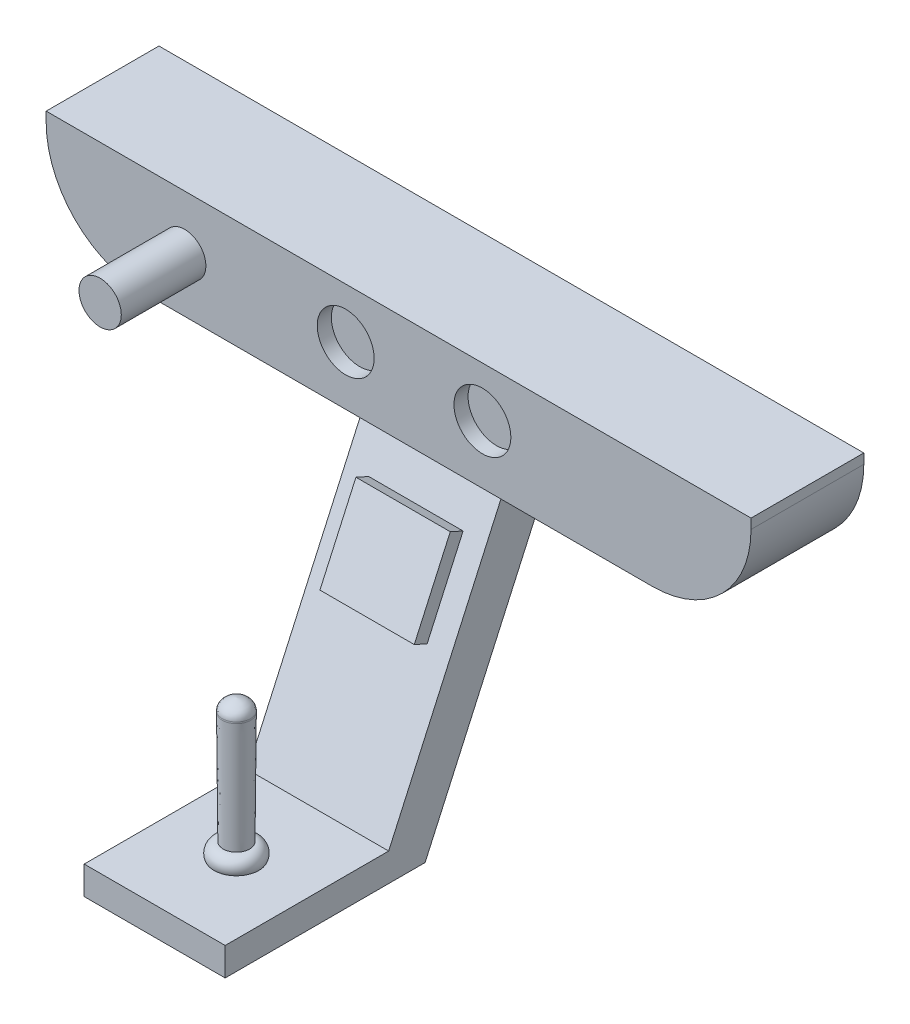
ISO-10303-21;
HEADER;
FILE_DESCRIPTION(('STEP AP214'),'2;1');
FILE_NAME('part.step','',(''),(''),'','','');
FILE_SCHEMA(('AUTOMOTIVE_DESIGN { 1 0 10303 214 1 1 1 1 }'));
ENDSEC;
DATA;
#1=APPLICATION_CONTEXT('core data for automotive mechanical design processes');
#2=APPLICATION_PROTOCOL_DEFINITION('international standard','automotive_design',2000,#1);
#3=PRODUCT_CONTEXT('',#1,'mechanical');
#4=PRODUCT('Part','Part','',(#3));
#5=PRODUCT_RELATED_PRODUCT_CATEGORY('part','',(#4));
#6=PRODUCT_DEFINITION_FORMATION('','',#4);
#7=PRODUCT_DEFINITION_CONTEXT('part definition',#1,'design');
#8=PRODUCT_DEFINITION('design','',#6,#7);
#9=PRODUCT_DEFINITION_SHAPE('','',#8);
#10=(LENGTH_UNIT() NAMED_UNIT(*) SI_UNIT(.MILLI.,.METRE.));
#11=(NAMED_UNIT(*) PLANE_ANGLE_UNIT() SI_UNIT($,.RADIAN.));
#12=(NAMED_UNIT(*) SI_UNIT($,.STERADIAN.) SOLID_ANGLE_UNIT());
#13=UNCERTAINTY_MEASURE_WITH_UNIT(LENGTH_MEASURE(1.E-05),#10,'distance_accuracy_value','');
#14=(GEOMETRIC_REPRESENTATION_CONTEXT(3) GLOBAL_UNCERTAINTY_ASSIGNED_CONTEXT((#13)) GLOBAL_UNIT_ASSIGNED_CONTEXT((#10,
#11,#12)) REPRESENTATION_CONTEXT('',''));
#15=CARTESIAN_POINT('',(0.,0.,0.));
#16=DIRECTION('',(0.,0.,1.));
#17=DIRECTION('',(1.,0.,0.));
#18=AXIS2_PLACEMENT_3D('',#15,#16,#17);
#19=CARTESIAN_POINT('',(5.,-25.7,15.6092851931351));
#20=DIRECTION('',(0.,-0.411295964451016,-0.911501853879798));
#21=DIRECTION('',(0.,0.911501853879798,-0.411295964451016));
#22=AXIS2_PLACEMENT_3D('',#19,#20,#21);
#23=PLANE('',#22);
#24=DIRECTION('',(0.,-0.911501853879798,0.411295964451016));
#25=VECTOR('',#24,1.);
#26=CARTESIAN_POINT('',(-5.,-25.7,15.6092851931351));
#27=LINE('',#26,#25);
#28=CARTESIAN_POINT('',(-5.,-7.7,7.48716527795766));
#29=VERTEX_POINT('',#28);
#30=CARTESIAN_POINT('',(-5.,-25.7,15.6092851931351));
#31=VERTEX_POINT('',#30);
#32=EDGE_CURVE('E311',#29,#31,#27,.T.);
#33=ORIENTED_EDGE('',*,*,#32,.T.);
#34=DIRECTION('',(-1.,0.,0.));
#35=VECTOR('',#34,1.);
#36=CARTESIAN_POINT('',(5.,-25.7,15.6092851931351));
#37=LINE('',#36,#35);
#38=CARTESIAN_POINT('',(5.,-25.7,15.6092851931351));
#39=VERTEX_POINT('',#38);
#40=EDGE_CURVE('E285',#39,#31,#37,.T.);
#41=ORIENTED_EDGE('',*,*,#40,.F.);
#42=DIRECTION('',(0.,-0.911501853879798,0.411295964451016));
#43=VECTOR('',#42,1.);
#44=CARTESIAN_POINT('',(5.,-25.7,15.6092851931351));
#45=LINE('',#44,#43);
#46=CARTESIAN_POINT('',(5.,-7.7,7.48716527795766));
#47=VERTEX_POINT('',#46);
#48=EDGE_CURVE('E324',#47,#39,#45,.T.);
#49=ORIENTED_EDGE('',*,*,#48,.F.);
#50=DIRECTION('',(-1.,0.,0.));
#51=VECTOR('',#50,1.);
#52=CARTESIAN_POINT('',(5.,-7.7,7.48716527795766));
#53=LINE('',#52,#51);
#54=EDGE_CURVE('E274',#47,#29,#53,.T.);
#55=ORIENTED_EDGE('',*,*,#54,.T.);
#56=EDGE_LOOP('',(#33,#41,#49,#55));
#57=FACE_BOUND('',#56,.T.);
#58=DIRECTION('',(0.,0.911501853879798,-0.411295964451016));
#59=VECTOR('',#58,1.);
#60=CARTESIAN_POINT('',(3.34576433974121,-15.9886792946912,11.2272567873982));
#61=LINE('',#60,#59);
#62=CARTESIAN_POINT('',(3.34576433974121,-15.9886792946912,11.2272567873982));
#63=VERTEX_POINT('',#62);
#64=CARTESIAN_POINT('',(3.34576433974121,-10.3319483511456,8.67477639565534));
#65=VERTEX_POINT('',#64);
#66=EDGE_CURVE('E345',#63,#65,#61,.T.);
#67=ORIENTED_EDGE('',*,*,#66,.F.);
#68=DIRECTION('',(1.,0.,0.));
#69=VECTOR('',#68,1.);
#70=CARTESIAN_POINT('',(-3.34576433974121,-15.9886792946912,11.2272567873982));
#71=LINE('',#70,#69);
#72=CARTESIAN_POINT('',(-3.34576433974121,-15.9886792946912,11.2272567873982));
#73=VERTEX_POINT('',#72);
#74=EDGE_CURVE('E339',#73,#63,#71,.T.);
#75=ORIENTED_EDGE('',*,*,#74,.F.);
#76=DIRECTION('',(0.,-0.911501853879798,0.411295964451016));
#77=VECTOR('',#76,1.);
#78=CARTESIAN_POINT('',(-3.34576433974121,-15.9886792946912,11.2272567873982));
#79=LINE('',#78,#77);
#80=CARTESIAN_POINT('',(-3.34576433974121,-10.3319483511456,8.67477639565534));
#81=VERTEX_POINT('',#80);
#82=EDGE_CURVE('E57',#81,#73,#79,.T.);
#83=ORIENTED_EDGE('',*,*,#82,.F.);
#84=DIRECTION('',(-1.,0.,0.));
#85=VECTOR('',#84,1.);
#86=CARTESIAN_POINT('',(-3.34576433974121,-10.3319483511456,8.67477639565534));
#87=LINE('',#86,#85);
#88=EDGE_CURVE('E52',#65,#81,#87,.T.);
#89=ORIENTED_EDGE('',*,*,#88,.F.);
#90=EDGE_LOOP('',(#67,#75,#83,#89));
#91=FACE_BOUND('',#90,.T.);
#92=ADVANCED_FACE('F37',(#57,#91),#23,.F.);
#93=CARTESIAN_POINT('',(-19.9035500993761,-7.7,8.));
#94=DIRECTION('',(0.,1.,0.));
#95=DIRECTION('',(0.,0.,1.));
#96=AXIS2_PLACEMENT_3D('',#93,#94,#95);
#97=PLANE('',#96);
#98=DIRECTION('',(1.,0.,0.));
#99=VECTOR('',#98,1.);
#100=CARTESIAN_POINT('',(-19.9035500993761,-7.7,0.));
#101=LINE('',#100,#99);
#102=CARTESIAN_POINT('',(-19.9035500993761,-7.7,0.));
#103=VERTEX_POINT('',#102);
#104=CARTESIAN_POINT('',(16.0964499006238,-7.7,0.));
#105=VERTEX_POINT('',#104);
#106=EDGE_CURVE('E225',#103,#105,#101,.T.);
#107=ORIENTED_EDGE('',*,*,#106,.T.);
#108=DIRECTION('',(0.,0.,-1.));
#109=VECTOR('',#108,1.);
#110=CARTESIAN_POINT('',(16.0964499006238,-7.7,8.));
#111=LINE('',#110,#109);
#112=CARTESIAN_POINT('',(16.0964499006238,-7.7,8.));
#113=VERTEX_POINT('',#112);
#114=EDGE_CURVE('E232',#113,#105,#111,.T.);
#115=ORIENTED_EDGE('',*,*,#114,.F.);
#116=DIRECTION('',(1.,0.,0.));
#117=VECTOR('',#116,1.);
#118=CARTESIAN_POINT('',(-19.9035500993761,-7.7,8.));
#119=LINE('',#118,#117);
#120=CARTESIAN_POINT('',(-19.9035500993761,-7.7,8.));
#121=VERTEX_POINT('',#120);
#122=EDGE_CURVE('E231',#121,#113,#119,.T.);
#123=ORIENTED_EDGE('',*,*,#122,.F.);
#124=DIRECTION('',(0.,0.,-1.));
#125=VECTOR('',#124,1.);
#126=CARTESIAN_POINT('',(-19.9035500993761,-7.7,8.));
#127=LINE('',#126,#125);
#128=EDGE_CURVE('E219',#121,#103,#127,.T.);
#129=ORIENTED_EDGE('',*,*,#128,.T.);
#130=EDGE_LOOP('',(#107,#115,#123,#129));
#131=FACE_BOUND('',#130,.T.);
#132=DIRECTION('',(0.,0.,1.));
#133=VECTOR('',#132,1.);
#134=CARTESIAN_POINT('',(5.,-7.7,7.48716527795766));
#135=LINE('',#134,#133);
#136=CARTESIAN_POINT('',(5.,-7.7,4.));
#137=VERTEX_POINT('',#136);
#138=EDGE_CURVE('E303',#137,#47,#135,.T.);
#139=ORIENTED_EDGE('',*,*,#138,.F.);
#140=DIRECTION('',(-1.,0.,0.));
#141=VECTOR('',#140,1.);
#142=CARTESIAN_POINT('',(5.,-7.7,4.));
#143=LINE('',#142,#141);
#144=CARTESIAN_POINT('',(-5.,-7.7,4.));
#145=VERTEX_POINT('',#144);
#146=EDGE_CURVE('E297',#137,#145,#143,.T.);
#147=ORIENTED_EDGE('',*,*,#146,.T.);
#148=DIRECTION('',(0.,0.,1.));
#149=VECTOR('',#148,1.);
#150=CARTESIAN_POINT('',(-5.,-7.7,7.48716527795766));
#151=LINE('',#150,#149);
#152=EDGE_CURVE('E313',#145,#29,#151,.T.);
#153=ORIENTED_EDGE('',*,*,#152,.T.);
#154=ORIENTED_EDGE('',*,*,#54,.F.);
#155=EDGE_LOOP('',(#139,#147,#153,#154));
#156=FACE_BOUND('',#155,.T.);
#157=ADVANCED_FACE('F168',(#131,#156),#97,.F.);
#158=CARTESIAN_POINT('',(-26.9035500993761,0.,8.));
#159=DIRECTION('',(1.,0.,0.));
#160=DIRECTION('',(0.,0.,-1.));
#161=AXIS2_PLACEMENT_3D('',#158,#159,#160);
#162=PLANE('',#161);
#163=DIRECTION('',(0.,-1.,0.));
#164=VECTOR('',#163,1.);
#165=CARTESIAN_POINT('',(-26.9035500993761,0.,0.));
#166=LINE('',#165,#164);
#167=CARTESIAN_POINT('',(-26.9035500993761,0.,0.));
#168=VERTEX_POINT('',#167);
#169=CARTESIAN_POINT('',(-26.9035500993761,-0.699999999999953,0.));
#170=VERTEX_POINT('',#169);
#171=EDGE_CURVE('E226',#168,#170,#166,.T.);
#172=ORIENTED_EDGE('',*,*,#171,.T.);
#173=DIRECTION('',(0.,0.,-1.));
#174=VECTOR('',#173,1.);
#175=CARTESIAN_POINT('',(-26.9035500993761,-0.699999999999953,8.));
#176=LINE('',#175,#174);
#177=CARTESIAN_POINT('',(-26.9035500993761,-0.699999999999953,8.));
#178=VERTEX_POINT('',#177);
#179=EDGE_CURVE('E45',#178,#170,#176,.T.);
#180=ORIENTED_EDGE('',*,*,#179,.F.);
#181=DIRECTION('',(0.,-1.,0.));
#182=VECTOR('',#181,1.);
#183=CARTESIAN_POINT('',(-26.9035500993761,0.,8.));
#184=LINE('',#183,#182);
#185=CARTESIAN_POINT('',(-26.9035500993761,0.,8.));
#186=VERTEX_POINT('',#185);
#187=EDGE_CURVE('E245',#186,#178,#184,.T.);
#188=ORIENTED_EDGE('',*,*,#187,.F.);
#189=DIRECTION('',(0.,0.,-1.));
#190=VECTOR('',#189,1.);
#191=CARTESIAN_POINT('',(-26.9035500993761,0.,8.));
#192=LINE('',#191,#190);
#193=EDGE_CURVE('E246',#186,#168,#192,.T.);
#194=ORIENTED_EDGE('',*,*,#193,.T.);
#195=EDGE_LOOP('',(#172,#180,#188,#194));
#196=FACE_BOUND('',#195,.T.);
#197=ADVANCED_FACE('F39',(#196),#162,.F.);
#198=CARTESIAN_POINT('',(-19.9035500993761,-0.7,8.));
#199=DIRECTION('',(0.,0.,-1.));
#200=DIRECTION('',(-1.,0.,0.));
#201=AXIS2_PLACEMENT_3D('',#198,#199,#200);
#202=CYLINDRICAL_SURFACE('',#201,7.);
#203=CARTESIAN_POINT('',(-19.9035500993761,-0.7,0.));
#204=DIRECTION('',(0.,0.,1.));
#205=DIRECTION('',(1.,0.,0.));
#206=AXIS2_PLACEMENT_3D('',#203,#204,#205);
#207=CIRCLE('',#206,7.);
#208=EDGE_CURVE('E217',#170,#103,#207,.T.);
#209=ORIENTED_EDGE('',*,*,#208,.T.);
#210=ORIENTED_EDGE('',*,*,#128,.F.);
#211=CARTESIAN_POINT('',(-19.9035500993761,-0.7,8.));
#212=DIRECTION('',(0.,0.,1.));
#213=DIRECTION('',(1.,0.,0.));
#214=AXIS2_PLACEMENT_3D('',#211,#212,#213);
#215=CIRCLE('',#214,7.);
#216=EDGE_CURVE('E264',#178,#121,#215,.T.);
#217=ORIENTED_EDGE('',*,*,#216,.F.);
#218=ORIENTED_EDGE('',*,*,#179,.T.);
#219=EDGE_LOOP('',(#209,#210,#217,#218));
#220=FACE_BOUND('',#219,.T.);
#221=ADVANCED_FACE('F207',(#220),#202,.T.);
#222=CARTESIAN_POINT('',(16.0964499006239,-0.699999999999999,8.));
#223=DIRECTION('',(0.,0.,-1.));
#224=DIRECTION('',(-1.,0.,0.));
#225=AXIS2_PLACEMENT_3D('',#222,#223,#224);
#226=CYLINDRICAL_SURFACE('',#225,7.);
#227=CARTESIAN_POINT('',(16.0964499006239,-0.699999999999999,0.));
#228=DIRECTION('',(0.,0.,1.));
#229=DIRECTION('',(1.,0.,0.));
#230=AXIS2_PLACEMENT_3D('',#227,#228,#229);
#231=CIRCLE('',#230,7.);
#232=CARTESIAN_POINT('',(23.0964499006239,-0.699999999999952,0.));
#233=VERTEX_POINT('',#232);
#234=EDGE_CURVE('E236',#105,#233,#231,.T.);
#235=ORIENTED_EDGE('',*,*,#234,.T.);
#236=DIRECTION('',(0.,0.,-1.));
#237=VECTOR('',#236,1.);
#238=CARTESIAN_POINT('',(23.0964499006239,-0.699999999999952,8.));
#239=LINE('',#238,#237);
#240=CARTESIAN_POINT('',(23.0964499006239,-0.699999999999952,8.));
#241=VERTEX_POINT('',#240);
#242=EDGE_CURVE('E253',#241,#233,#239,.T.);
#243=ORIENTED_EDGE('',*,*,#242,.F.);
#244=CARTESIAN_POINT('',(16.0964499006239,-0.699999999999999,8.));
#245=DIRECTION('',(0.,0.,1.));
#246=DIRECTION('',(1.,0.,0.));
#247=AXIS2_PLACEMENT_3D('',#244,#245,#246);
#248=CIRCLE('',#247,7.);
#249=EDGE_CURVE('E258',#113,#241,#248,.T.);
#250=ORIENTED_EDGE('',*,*,#249,.F.);
#251=ORIENTED_EDGE('',*,*,#114,.T.);
#252=EDGE_LOOP('',(#235,#243,#250,#251));
#253=FACE_BOUND('',#252,.T.);
#254=ADVANCED_FACE('F204',(#253),#226,.T.);
#255=CARTESIAN_POINT('',(23.0964499006239,-0.699999999999952,8.));
#256=DIRECTION('',(-1.,0.,0.));
#257=DIRECTION('',(0.,0.,1.));
#258=AXIS2_PLACEMENT_3D('',#255,#256,#257);
#259=PLANE('',#258);
#260=DIRECTION('',(0.,1.,0.));
#261=VECTOR('',#260,1.);
#262=CARTESIAN_POINT('',(23.0964499006239,-0.699999999999952,0.));
#263=LINE('',#262,#261);
#264=CARTESIAN_POINT('',(23.0964499006239,0.,0.));
#265=VERTEX_POINT('',#264);
#266=EDGE_CURVE('E238',#233,#265,#263,.T.);
#267=ORIENTED_EDGE('',*,*,#266,.T.);
#268=DIRECTION('',(0.,0.,-1.));
#269=VECTOR('',#268,1.);
#270=CARTESIAN_POINT('',(23.0964499006239,0.,8.));
#271=LINE('',#270,#269);
#272=CARTESIAN_POINT('',(23.0964499006239,0.,8.));
#273=VERTEX_POINT('',#272);
#274=EDGE_CURVE('E249',#273,#265,#271,.T.);
#275=ORIENTED_EDGE('',*,*,#274,.F.);
#276=DIRECTION('',(0.,1.,0.));
#277=VECTOR('',#276,1.);
#278=CARTESIAN_POINT('',(23.0964499006239,-0.699999999999952,8.));
#279=LINE('',#278,#277);
#280=EDGE_CURVE('E261',#241,#273,#279,.T.);
#281=ORIENTED_EDGE('',*,*,#280,.F.);
#282=ORIENTED_EDGE('',*,*,#242,.T.);
#283=EDGE_LOOP('',(#267,#275,#281,#282));
#284=FACE_BOUND('',#283,.T.);
#285=ADVANCED_FACE('F200',(#284),#259,.F.);
#286=CARTESIAN_POINT('',(-26.9035500993761,0.,8.));
#287=DIRECTION('',(0.,-1.,0.));
#288=DIRECTION('',(0.,0.,-1.));
#289=AXIS2_PLACEMENT_3D('',#286,#287,#288);
#290=PLANE('',#289);
#291=DIRECTION('',(-1.,0.,0.));
#292=VECTOR('',#291,1.);
#293=CARTESIAN_POINT('',(-26.9035500993761,0.,0.));
#294=LINE('',#293,#292);
#295=EDGE_CURVE('E243',#265,#168,#294,.T.);
#296=ORIENTED_EDGE('',*,*,#295,.T.);
#297=ORIENTED_EDGE('',*,*,#193,.F.);
#298=DIRECTION('',(-1.,0.,0.));
#299=VECTOR('',#298,1.);
#300=CARTESIAN_POINT('',(-26.9035500993761,0.,8.));
#301=LINE('',#300,#299);
#302=EDGE_CURVE('E250',#273,#186,#301,.T.);
#303=ORIENTED_EDGE('',*,*,#302,.F.);
#304=ORIENTED_EDGE('',*,*,#274,.T.);
#305=EDGE_LOOP('',(#296,#297,#303,#304));
#306=FACE_BOUND('',#305,.T.);
#307=ADVANCED_FACE('F193',(#306),#290,.F.);
#308=CARTESIAN_POINT('',(-19.9035500993761,-0.7,8.));
#309=DIRECTION('',(0.,0.,1.));
#310=DIRECTION('',(1.,0.,0.));
#311=AXIS2_PLACEMENT_3D('',#308,#309,#310);
#312=PLANE('',#311);
#313=CARTESIAN_POINT('',(4.04038869305368,-3.56228736907793,8.));
#314=DIRECTION('',(0.,0.,1.));
#315=DIRECTION('',(1.,0.,0.));
#316=AXIS2_PLACEMENT_3D('',#313,#314,#315);
#317=CIRCLE('',#316,2.01835637604764);
#318=CARTESIAN_POINT('',(6.05874506910132,-3.56228736907793,8.));
#319=VERTEX_POINT('',#318);
#320=EDGE_CURVE('E362',#319,#319,#317,.T.);
#321=ORIENTED_EDGE('',*,*,#320,.F.);
#322=EDGE_LOOP('',(#321));
#323=FACE_BOUND('',#322,.T.);
#324=CARTESIAN_POINT('',(-5.65761670512124,-3.56228736907793,8.));
#325=DIRECTION('',(0.,0.,1.));
#326=DIRECTION('',(1.,0.,0.));
#327=AXIS2_PLACEMENT_3D('',#324,#325,#326);
#328=CIRCLE('',#327,2.01835637604764);
#329=CARTESIAN_POINT('',(-3.63926032907359,-3.56228736907793,8.));
#330=VERTEX_POINT('',#329);
#331=EDGE_CURVE('E356',#330,#330,#328,.T.);
#332=ORIENTED_EDGE('',*,*,#331,.F.);
#333=EDGE_LOOP('',(#332));
#334=FACE_BOUND('',#333,.T.);
#335=CARTESIAN_POINT('',(-17.0762359642627,-3.85,8.));
#336=DIRECTION('',(0.,0.,1.));
#337=DIRECTION('',(1.,0.,0.));
#338=AXIS2_PLACEMENT_3D('',#335,#336,#337);
#339=CIRCLE('',#338,1.5);
#340=CARTESIAN_POINT('',(-15.5762359642627,-3.85,8.));
#341=VERTEX_POINT('',#340);
#342=EDGE_CURVE('E270',#341,#341,#339,.T.);
#343=ORIENTED_EDGE('',*,*,#342,.F.);
#344=EDGE_LOOP('',(#343));
#345=FACE_BOUND('',#344,.T.);
#346=ORIENTED_EDGE('',*,*,#187,.T.);
#347=ORIENTED_EDGE('',*,*,#216,.T.);
#348=ORIENTED_EDGE('',*,*,#122,.T.);
#349=ORIENTED_EDGE('',*,*,#249,.T.);
#350=ORIENTED_EDGE('',*,*,#280,.T.);
#351=ORIENTED_EDGE('',*,*,#302,.T.);
#352=EDGE_LOOP('',(#346,#347,#348,#349,#350,#351));
#353=FACE_BOUND('',#352,.T.);
#354=ADVANCED_FACE('F190',(#323,#334,#345,#353),#312,.T.);
#355=CARTESIAN_POINT('',(-19.9035500993761,-0.7,0.));
#356=DIRECTION('',(0.,0.,1.));
#357=DIRECTION('',(1.,0.,0.));
#358=AXIS2_PLACEMENT_3D('',#355,#356,#357);
#359=PLANE('',#358);
#360=ORIENTED_EDGE('',*,*,#171,.F.);
#361=ORIENTED_EDGE('',*,*,#295,.F.);
#362=ORIENTED_EDGE('',*,*,#266,.F.);
#363=ORIENTED_EDGE('',*,*,#234,.F.);
#364=ORIENTED_EDGE('',*,*,#106,.F.);
#365=ORIENTED_EDGE('',*,*,#208,.F.);
#366=EDGE_LOOP('',(#360,#361,#362,#363,#364,#365));
#367=FACE_BOUND('',#366,.T.);
#368=ADVANCED_FACE('F188',(#367),#359,.F.);
#369=CARTESIAN_POINT('',(-17.0762359642627,-3.85,14.));
#370=DIRECTION('',(0.,0.,-1.));
#371=DIRECTION('',(-1.,0.,0.));
#372=AXIS2_PLACEMENT_3D('',#369,#370,#371);
#373=CYLINDRICAL_SURFACE('',#372,1.5);
#374=CARTESIAN_POINT('',(-17.0762359642627,-3.85,14.));
#375=DIRECTION('',(0.,0.,1.));
#376=DIRECTION('',(1.,0.,0.));
#377=AXIS2_PLACEMENT_3D('',#374,#375,#376);
#378=CIRCLE('',#377,1.5);
#379=CARTESIAN_POINT('',(-15.5762359642627,-3.85,14.));
#380=VERTEX_POINT('',#379);
#381=EDGE_CURVE('E268',#380,#380,#378,.T.);
#382=ORIENTED_EDGE('',*,*,#381,.F.);
#383=EDGE_LOOP('',(#382));
#384=FACE_BOUND('',#383,.T.);
#385=ORIENTED_EDGE('',*,*,#342,.T.);
#386=EDGE_LOOP('',(#385));
#387=FACE_BOUND('',#386,.T.);
#388=ADVANCED_FACE('F184',(#384,#387),#373,.T.);
#389=CARTESIAN_POINT('',(-17.0762359642627,-3.85,14.));
#390=DIRECTION('',(0.,0.,1.));
#391=DIRECTION('',(1.,0.,0.));
#392=AXIS2_PLACEMENT_3D('',#389,#390,#391);
#393=PLANE('',#392);
#394=ORIENTED_EDGE('',*,*,#381,.T.);
#395=EDGE_LOOP('',(#394));
#396=FACE_BOUND('',#395,.T.);
#397=ADVANCED_FACE('F181',(#396),#393,.T.);
#398=CARTESIAN_POINT('',(5.,-25.7,25.0245776835305));
#399=DIRECTION('',(0.,-1.,0.));
#400=DIRECTION('',(0.,0.,-1.));
#401=AXIS2_PLACEMENT_3D('',#398,#399,#400);
#402=PLANE('',#401);
#403=CARTESIAN_POINT('',(0.,-25.7,21.4082241474404));
#404=DIRECTION('',(0.,-1.,0.));
#405=DIRECTION('',(0.,0.,-1.));
#406=AXIS2_PLACEMENT_3D('',#403,#404,#405);
#407=CIRCLE('',#406,1.58877463096778);
#408=CARTESIAN_POINT('',(0.,-25.7,19.8194495164726));
#409=VERTEX_POINT('',#408);
#410=EDGE_CURVE('E11',#409,#409,#407,.F.);
#411=ORIENTED_EDGE('',*,*,#410,.F.);
#412=EDGE_LOOP('',(#411));
#413=FACE_BOUND('',#412,.T.);
#414=DIRECTION('',(0.,0.,1.));
#415=VECTOR('',#414,1.);
#416=CARTESIAN_POINT('',(-5.,-25.7,25.0245776835305));
#417=LINE('',#416,#415);
#418=CARTESIAN_POINT('',(-5.,-25.7,27.2071631017457));
#419=VERTEX_POINT('',#418);
#420=EDGE_CURVE('E309',#31,#419,#417,.T.);
#421=ORIENTED_EDGE('',*,*,#420,.T.);
#422=DIRECTION('',(-1.,0.,0.));
#423=VECTOR('',#422,1.);
#424=CARTESIAN_POINT('',(5.,-25.7,27.2071631017457));
#425=LINE('',#424,#423);
#426=CARTESIAN_POINT('',(5.,-25.7,27.2071631017457));
#427=VERTEX_POINT('',#426);
#428=EDGE_CURVE('E288',#427,#419,#425,.T.);
#429=ORIENTED_EDGE('',*,*,#428,.F.);
#430=DIRECTION('',(0.,0.,1.));
#431=VECTOR('',#430,1.);
#432=CARTESIAN_POINT('',(5.,-25.7,25.0245776835305));
#433=LINE('',#432,#431);
#434=EDGE_CURVE('E322',#39,#427,#433,.T.);
#435=ORIENTED_EDGE('',*,*,#434,.F.);
#436=ORIENTED_EDGE('',*,*,#40,.T.);
#437=EDGE_LOOP('',(#421,#429,#435,#436));
#438=FACE_BOUND('',#437,.T.);
#439=ADVANCED_FACE('F179',(#413,#438),#402,.F.);
#440=CARTESIAN_POINT('',(5.,-25.7,27.2071631017457));
#441=DIRECTION('',(0.,0.,-1.));
#442=DIRECTION('',(0.,1.,0.));
#443=AXIS2_PLACEMENT_3D('',#440,#441,#442);
#444=PLANE('',#443);
#445=DIRECTION('',(0.,-1.,0.));
#446=VECTOR('',#445,1.);
#447=CARTESIAN_POINT('',(-5.,-25.7,27.2071631017457));
#448=LINE('',#447,#446);
#449=CARTESIAN_POINT('',(-5.,-27.7,27.2071631017457));
#450=VERTEX_POINT('',#449);
#451=EDGE_CURVE('E306',#419,#450,#448,.T.);
#452=ORIENTED_EDGE('',*,*,#451,.T.);
#453=DIRECTION('',(-1.,0.,0.));
#454=VECTOR('',#453,1.);
#455=CARTESIAN_POINT('',(5.,-27.7,27.2071631017457));
#456=LINE('',#455,#454);
#457=CARTESIAN_POINT('',(5.,-27.7,27.2071631017457));
#458=VERTEX_POINT('',#457);
#459=EDGE_CURVE('E291',#458,#450,#456,.T.);
#460=ORIENTED_EDGE('',*,*,#459,.F.);
#461=DIRECTION('',(0.,-1.,0.));
#462=VECTOR('',#461,1.);
#463=CARTESIAN_POINT('',(5.,-25.7,27.2071631017457));
#464=LINE('',#463,#462);
#465=EDGE_CURVE('E320',#427,#458,#464,.T.);
#466=ORIENTED_EDGE('',*,*,#465,.F.);
#467=ORIENTED_EDGE('',*,*,#428,.T.);
#468=EDGE_LOOP('',(#452,#460,#466,#467));
#469=FACE_BOUND('',#468,.T.);
#470=ADVANCED_FACE('F401',(#469),#444,.F.);
#471=CARTESIAN_POINT('',(5.,-27.7,13.0245776835305));
#472=DIRECTION('',(0.,1.,0.));
#473=DIRECTION('',(0.,0.,1.));
#474=AXIS2_PLACEMENT_3D('',#471,#472,#473);
#475=PLANE('',#474);
#476=DIRECTION('',(0.,0.,-1.));
#477=VECTOR('',#476,1.);
#478=CARTESIAN_POINT('',(-5.,-27.7,13.0245776835305));
#479=LINE('',#478,#477);
#480=CARTESIAN_POINT('',(-5.,-27.7,13.0245776835305));
#481=VERTEX_POINT('',#480);
#482=EDGE_CURVE('E304',#450,#481,#479,.T.);
#483=ORIENTED_EDGE('',*,*,#482,.T.);
#484=DIRECTION('',(-1.,0.,0.));
#485=VECTOR('',#484,1.);
#486=CARTESIAN_POINT('',(5.,-27.7,13.0245776835305));
#487=LINE('',#486,#485);
#488=CARTESIAN_POINT('',(5.,-27.7,13.0245776835305));
#489=VERTEX_POINT('',#488);
#490=EDGE_CURVE('E294',#489,#481,#487,.T.);
#491=ORIENTED_EDGE('',*,*,#490,.F.);
#492=DIRECTION('',(0.,0.,-1.));
#493=VECTOR('',#492,1.);
#494=CARTESIAN_POINT('',(5.,-27.7,27.2071631017457));
#495=LINE('',#494,#493);
#496=EDGE_CURVE('E318',#458,#489,#495,.T.);
#497=ORIENTED_EDGE('',*,*,#496,.F.);
#498=ORIENTED_EDGE('',*,*,#459,.T.);
#499=EDGE_LOOP('',(#483,#491,#497,#498));
#500=FACE_BOUND('',#499,.T.);
#501=ADVANCED_FACE('F416',(#500),#475,.F.);
#502=CARTESIAN_POINT('',(5.,-7.7,4.));
#503=DIRECTION('',(0.,0.411295964451016,0.911501853879798));
#504=DIRECTION('',(0.,-0.911501853879798,0.411295964451016));
#505=AXIS2_PLACEMENT_3D('',#502,#503,#504);
#506=PLANE('',#505);
#507=DIRECTION('',(0.,0.911501853879798,-0.411295964451016));
#508=VECTOR('',#507,1.);
#509=CARTESIAN_POINT('',(-5.,-7.7,4.));
#510=LINE('',#509,#508);
#511=EDGE_CURVE('E301',#481,#145,#510,.T.);
#512=ORIENTED_EDGE('',*,*,#511,.T.);
#513=ORIENTED_EDGE('',*,*,#146,.F.);
#514=DIRECTION('',(0.,0.911501853879798,-0.411295964451016));
#515=VECTOR('',#514,1.);
#516=CARTESIAN_POINT('',(5.,-7.7,4.));
#517=LINE('',#516,#515);
#518=EDGE_CURVE('E300',#489,#137,#517,.T.);
#519=ORIENTED_EDGE('',*,*,#518,.F.);
#520=ORIENTED_EDGE('',*,*,#490,.T.);
#521=EDGE_LOOP('',(#512,#513,#519,#520));
#522=FACE_BOUND('',#521,.T.);
#523=ADVANCED_FACE('F420',(#522),#506,.F.);
#524=CARTESIAN_POINT('',(5.,0.,0.));
#525=DIRECTION('',(-1.,0.,0.));
#526=DIRECTION('',(0.,0.,1.));
#527=AXIS2_PLACEMENT_3D('',#524,#525,#526);
#528=PLANE('',#527);
#529=ORIENTED_EDGE('',*,*,#138,.T.);
#530=ORIENTED_EDGE('',*,*,#48,.T.);
#531=ORIENTED_EDGE('',*,*,#434,.T.);
#532=ORIENTED_EDGE('',*,*,#465,.T.);
#533=ORIENTED_EDGE('',*,*,#496,.T.);
#534=ORIENTED_EDGE('',*,*,#518,.T.);
#535=EDGE_LOOP('',(#529,#530,#531,#532,#533,#534));
#536=FACE_BOUND('',#535,.T.);
#537=ADVANCED_FACE('F424',(#536),#528,.F.);
#538=CARTESIAN_POINT('',(-5.,0.,0.));
#539=DIRECTION('',(-1.,0.,0.));
#540=DIRECTION('',(0.,0.,1.));
#541=AXIS2_PLACEMENT_3D('',#538,#539,#540);
#542=PLANE('',#541);
#543=ORIENTED_EDGE('',*,*,#152,.F.);
#544=ORIENTED_EDGE('',*,*,#511,.F.);
#545=ORIENTED_EDGE('',*,*,#482,.F.);
#546=ORIENTED_EDGE('',*,*,#451,.F.);
#547=ORIENTED_EDGE('',*,*,#420,.F.);
#548=ORIENTED_EDGE('',*,*,#32,.F.);
#549=EDGE_LOOP('',(#543,#544,#545,#546,#547,#548));
#550=FACE_BOUND('',#549,.T.);
#551=ADVANCED_FACE('F412',(#550),#542,.T.);
#552=CARTESIAN_POINT('',(3.34576433974121,-15.5773833302401,12.138758641278));
#553=DIRECTION('',(-1.,0.,0.));
#554=DIRECTION('',(0.,0.,1.));
#555=AXIS2_PLACEMENT_3D('',#552,#553,#554);
#556=PLANE('',#555);
#557=ORIENTED_EDGE('',*,*,#66,.T.);
#558=DIRECTION('',(0.,-0.411295964451016,-0.911501853879798));
#559=VECTOR('',#558,1.);
#560=CARTESIAN_POINT('',(3.34576433974121,-9.92065238669459,9.58627824953514));
#561=LINE('',#560,#559);
#562=CARTESIAN_POINT('',(3.34576433974121,-9.92065238669459,9.58627824953514));
#563=VERTEX_POINT('',#562);
#564=EDGE_CURVE('E316',#563,#65,#561,.T.);
#565=ORIENTED_EDGE('',*,*,#564,.F.);
#566=DIRECTION('',(0.,0.911501853879798,-0.411295964451016));
#567=VECTOR('',#566,1.);
#568=CARTESIAN_POINT('',(3.34576433974121,-15.5773833302401,12.138758641278));
#569=LINE('',#568,#567);
#570=CARTESIAN_POINT('',(3.34576433974121,-15.5773833302401,12.138758641278));
#571=VERTEX_POINT('',#570);
#572=EDGE_CURVE('E342',#571,#563,#569,.T.);
#573=ORIENTED_EDGE('',*,*,#572,.F.);
#574=DIRECTION('',(0.,-0.411295964451016,-0.911501853879798));
#575=VECTOR('',#574,1.);
#576=CARTESIAN_POINT('',(3.34576433974121,-15.5773833302401,12.138758641278));
#577=LINE('',#576,#575);
#578=EDGE_CURVE('E335',#571,#63,#577,.T.);
#579=ORIENTED_EDGE('',*,*,#578,.T.);
#580=EDGE_LOOP('',(#557,#565,#573,#579));
#581=FACE_BOUND('',#580,.T.);
#582=ADVANCED_FACE('F432',(#581),#556,.F.);
#583=CARTESIAN_POINT('',(-3.34576433974121,-9.92065238669459,9.58627824953514));
#584=DIRECTION('',(0.,-0.911501853879798,0.411295964451016));
#585=DIRECTION('',(0.,-0.411295964451016,-0.911501853879798));
#586=AXIS2_PLACEMENT_3D('',#583,#584,#585);
#587=PLANE('',#586);
#588=ORIENTED_EDGE('',*,*,#88,.T.);
#589=DIRECTION('',(0.,-0.411295964451016,-0.911501853879798));
#590=VECTOR('',#589,1.);
#591=CARTESIAN_POINT('',(-3.34576433974121,-9.92065238669459,9.58627824953514));
#592=LINE('',#591,#590);
#593=CARTESIAN_POINT('',(-3.34576433974121,-9.92065238669459,9.58627824953514));
#594=VERTEX_POINT('',#593);
#595=EDGE_CURVE('E329',#594,#81,#592,.T.);
#596=ORIENTED_EDGE('',*,*,#595,.F.);
#597=DIRECTION('',(-1.,0.,0.));
#598=VECTOR('',#597,1.);
#599=CARTESIAN_POINT('',(-3.34576433974121,-9.92065238669459,9.58627824953514));
#600=LINE('',#599,#598);
#601=EDGE_CURVE('E352',#563,#594,#600,.T.);
#602=ORIENTED_EDGE('',*,*,#601,.F.);
#603=ORIENTED_EDGE('',*,*,#564,.T.);
#604=EDGE_LOOP('',(#588,#596,#602,#603));
#605=FACE_BOUND('',#604,.T.);
#606=ADVANCED_FACE('F476',(#605),#587,.F.);
#607=CARTESIAN_POINT('',(-3.34576433974121,-15.5773833302401,12.138758641278));
#608=DIRECTION('',(1.,0.,0.));
#609=DIRECTION('',(0.,0.,-1.));
#610=AXIS2_PLACEMENT_3D('',#607,#608,#609);
#611=PLANE('',#610);
#612=ORIENTED_EDGE('',*,*,#82,.T.);
#613=DIRECTION('',(0.,-0.411295964451016,-0.911501853879798));
#614=VECTOR('',#613,1.);
#615=CARTESIAN_POINT('',(-3.34576433974121,-15.5773833302401,12.138758641278));
#616=LINE('',#615,#614);
#617=CARTESIAN_POINT('',(-3.34576433974121,-15.5773833302401,12.138758641278));
#618=VERTEX_POINT('',#617);
#619=EDGE_CURVE('E332',#618,#73,#616,.T.);
#620=ORIENTED_EDGE('',*,*,#619,.F.);
#621=DIRECTION('',(0.,-0.911501853879798,0.411295964451016));
#622=VECTOR('',#621,1.);
#623=CARTESIAN_POINT('',(-3.34576433974121,-15.5773833302401,12.138758641278));
#624=LINE('',#623,#622);
#625=EDGE_CURVE('E350',#594,#618,#624,.T.);
#626=ORIENTED_EDGE('',*,*,#625,.F.);
#627=ORIENTED_EDGE('',*,*,#595,.T.);
#628=EDGE_LOOP('',(#612,#620,#626,#627));
#629=FACE_BOUND('',#628,.T.);
#630=ADVANCED_FACE('F485',(#629),#611,.F.);
#631=CARTESIAN_POINT('',(-3.34576433974121,-15.5773833302401,12.138758641278));
#632=DIRECTION('',(0.,0.911501853879798,-0.411295964451016));
#633=DIRECTION('',(0.,0.411295964451016,0.911501853879798));
#634=AXIS2_PLACEMENT_3D('',#631,#632,#633);
#635=PLANE('',#634);
#636=ORIENTED_EDGE('',*,*,#74,.T.);
#637=ORIENTED_EDGE('',*,*,#578,.F.);
#638=DIRECTION('',(1.,0.,0.));
#639=VECTOR('',#638,1.);
#640=CARTESIAN_POINT('',(-3.34576433974121,-15.5773833302401,12.138758641278));
#641=LINE('',#640,#639);
#642=EDGE_CURVE('E338',#618,#571,#641,.T.);
#643=ORIENTED_EDGE('',*,*,#642,.F.);
#644=ORIENTED_EDGE('',*,*,#619,.T.);
#645=EDGE_LOOP('',(#636,#637,#643,#644));
#646=FACE_BOUND('',#645,.T.);
#647=ADVANCED_FACE('F494',(#646),#635,.F.);
#648=CARTESIAN_POINT('',(0.,1.9156463690244,4.24539836921206));
#649=DIRECTION('',(0.,-0.411295964451016,-0.911501853879798));
#650=DIRECTION('',(0.,0.911501853879798,-0.411295964451016));
#651=AXIS2_PLACEMENT_3D('',#648,#649,#650);
#652=PLANE('',#651);
#653=ORIENTED_EDGE('',*,*,#572,.T.);
#654=ORIENTED_EDGE('',*,*,#601,.T.);
#655=ORIENTED_EDGE('',*,*,#625,.T.);
#656=ORIENTED_EDGE('',*,*,#642,.T.);
#657=EDGE_LOOP('',(#653,#654,#655,#656));
#658=FACE_BOUND('',#657,.T.);
#659=ADVANCED_FACE('F504',(#658),#652,.F.);
#660=CARTESIAN_POINT('',(-5.65761670512124,-3.56228736907793,7.));
#661=DIRECTION('',(0.,0.,1.));
#662=DIRECTION('',(1.,0.,0.));
#663=AXIS2_PLACEMENT_3D('',#660,#661,#662);
#664=CYLINDRICAL_SURFACE('',#663,2.01835637604764);
#665=CARTESIAN_POINT('',(-5.65761670512124,-3.56228736907793,7.));
#666=DIRECTION('',(0.,0.,1.));
#667=DIRECTION('',(1.,0.,0.));
#668=AXIS2_PLACEMENT_3D('',#665,#666,#667);
#669=CIRCLE('',#668,2.01835637604764);
#670=CARTESIAN_POINT('',(-3.63926032907359,-3.56228736907793,7.));
#671=VERTEX_POINT('',#670);
#672=EDGE_CURVE('E348',#671,#671,#669,.T.);
#673=ORIENTED_EDGE('',*,*,#672,.F.);
#674=EDGE_LOOP('',(#673));
#675=FACE_BOUND('',#674,.T.);
#676=ORIENTED_EDGE('',*,*,#331,.T.);
#677=EDGE_LOOP('',(#676));
#678=FACE_BOUND('',#677,.T.);
#679=ADVANCED_FACE('F514',(#675,#678),#664,.F.);
#680=CARTESIAN_POINT('',(-5.65761670512124,-3.56228736907793,7.));
#681=DIRECTION('',(0.,0.,1.));
#682=DIRECTION('',(1.,0.,0.));
#683=AXIS2_PLACEMENT_3D('',#680,#681,#682);
#684=PLANE('',#683);
#685=ORIENTED_EDGE('',*,*,#672,.T.);
#686=EDGE_LOOP('',(#685));
#687=FACE_BOUND('',#686,.T.);
#688=ADVANCED_FACE('F532',(#687),#684,.T.);
#689=CARTESIAN_POINT('',(4.04038869305368,-3.56228736907793,7.));
#690=DIRECTION('',(0.,0.,1.));
#691=DIRECTION('',(1.,0.,0.));
#692=AXIS2_PLACEMENT_3D('',#689,#690,#691);
#693=CYLINDRICAL_SURFACE('',#692,2.01835637604764);
#694=CARTESIAN_POINT('',(4.04038869305368,-3.56228736907793,7.));
#695=DIRECTION('',(0.,0.,1.));
#696=DIRECTION('',(1.,0.,0.));
#697=AXIS2_PLACEMENT_3D('',#694,#695,#696);
#698=CIRCLE('',#697,2.01835637604764);
#699=CARTESIAN_POINT('',(6.05874506910132,-3.56228736907793,7.));
#700=VERTEX_POINT('',#699);
#701=EDGE_CURVE('E359',#700,#700,#698,.T.);
#702=ORIENTED_EDGE('',*,*,#701,.F.);
#703=EDGE_LOOP('',(#702));
#704=FACE_BOUND('',#703,.T.);
#705=ORIENTED_EDGE('',*,*,#320,.T.);
#706=EDGE_LOOP('',(#705));
#707=FACE_BOUND('',#706,.T.);
#708=ADVANCED_FACE('F162',(#704,#707),#693,.F.);
#709=CARTESIAN_POINT('',(4.04038869305368,-3.56228736907793,7.));
#710=DIRECTION('',(0.,0.,1.));
#711=DIRECTION('',(1.,0.,0.));
#712=AXIS2_PLACEMENT_3D('',#709,#710,#711);
#713=PLANE('',#712);
#714=ORIENTED_EDGE('',*,*,#701,.T.);
#715=EDGE_LOOP('',(#714));
#716=FACE_BOUND('',#715,.T.);
#717=ADVANCED_FACE('F152',(#716),#713,.T.);
#718=CARTESIAN_POINT('',(0.,-15.8737428708481,21.4082241474404));
#719=CARTESIAN_POINT('',(0.,-16.0608757162635,22.4492597678891));
#720=CARTESIAN_POINT('',(0.,-16.7710894755294,22.4082241474404));
#721=B_SPLINE_CURVE_WITH_KNOTS('',2,(#718,#719,#720),.UNSPECIFIED.,.F.,.F.,(3,3),(0.,1.),.UNSPECIFIED.);
#722=CARTESIAN_POINT('',(0.,-25.7,21.4082241474404));
#723=DIRECTION('',(0.,-1.,0.));
#724=AXIS1_PLACEMENT('',#722,#723);
#725=SURFACE_OF_REVOLUTION('',#721,#724);
#726=CARTESIAN_POINT('',(0.,-16.6663642364457,21.4082241474404));
#727=DIRECTION('',(0.,-1.,0.));
#728=DIRECTION('',(0.,0.,-1.));
#729=AXIS2_PLACEMENT_3D('',#726,#727,#728);
#730=CIRCLE('',#729,0.999999999999987);
#731=CARTESIAN_POINT('',(0.,-16.6663642364457,20.4082241474404));
#732=VERTEX_POINT('',#731);
#733=EDGE_CURVE('E365',#732,#732,#730,.T.);
#734=ORIENTED_EDGE('',*,*,#733,.F.);
#735=EDGE_LOOP('',(#734));
#736=FACE_BOUND('',#735,.T.);
#737=CARTESIAN_POINT('',(0.,-15.8737428708481,21.4082241474404));
#738=VERTEX_POINT('',#737);
#739=VERTEX_LOOP('',#738);
#740=FACE_BOUND('',#739,.T.);
#741=ADVANCED_FACE('F149',(#736,#740),#725,.T.);
#742=CARTESIAN_POINT('',(0.,-25.7,21.4082241474404));
#743=DIRECTION('',(0.,-1.,0.));
#744=DIRECTION('',(0.,0.,-1.));
#745=AXIS2_PLACEMENT_3D('',#742,#743,#744);
#746=CYLINDRICAL_SURFACE('',#745,0.999999999999996);
#747=CARTESIAN_POINT('',(0.,-16.7710894755294,21.4082241474404));
#748=DIRECTION('',(0.,-1.,0.));
#749=DIRECTION('',(0.,0.,-1.));
#750=AXIS2_PLACEMENT_3D('',#747,#748,#749);
#751=CIRCLE('',#750,1.);
#752=CARTESIAN_POINT('',(0.,-16.7710894755294,20.4082241474404));
#753=VERTEX_POINT('',#752);
#754=EDGE_CURVE('E370',#753,#753,#751,.T.);
#755=ORIENTED_EDGE('',*,*,#754,.F.);
#756=EDGE_LOOP('',(#755));
#757=FACE_BOUND('',#756,.T.);
#758=ORIENTED_EDGE('',*,*,#733,.T.);
#759=EDGE_LOOP('',(#758));
#760=FACE_BOUND('',#759,.T.);
#761=ADVANCED_FACE('F151',(#757,#760),#746,.T.);
#762=CARTESIAN_POINT('',(0.,-16.7710894755294,21.4082241474404));
#763=DIRECTION('',(0.,1.,0.));
#764=DIRECTION('',(0.,0.,1.));
#765=AXIS2_PLACEMENT_3D('',#762,#763,#764);
#766=CONICAL_SURFACE('',#765,1.,0.0083199743491554);
#767=CARTESIAN_POINT('',(0.,-24.7124270975783,21.4082241474404));
#768=DIRECTION('',(0.,-1.,0.));
#769=DIRECTION('',(0.,0.,-1.));
#770=AXIS2_PLACEMENT_3D('',#767,#768,#769);
#771=CIRCLE('',#770,0.933926750105962);
#772=CARTESIAN_POINT('',(0.,-24.7124270975783,20.4742973973344));
#773=VERTEX_POINT('',#772);
#774=EDGE_CURVE('E373',#773,#773,#771,.T.);
#775=ORIENTED_EDGE('',*,*,#774,.F.);
#776=EDGE_LOOP('',(#775));
#777=FACE_BOUND('',#776,.T.);
#778=ORIENTED_EDGE('',*,*,#754,.T.);
#779=EDGE_LOOP('',(#778));
#780=FACE_BOUND('',#779,.T.);
#781=ADVANCED_FACE('F159',(#777,#780),#766,.T.);
#782=CARTESIAN_POINT('',(0.,-25.4272682623668,21.4082241474404));
#783=DIRECTION('',(0.,-1.,0.));
#784=DIRECTION('',(0.,0.,-1.));
#785=AXIS2_PLACEMENT_3D('',#782,#783,#784);
#786=TOROIDAL_SURFACE('',#785,0.927979152715759,0.714865906860003);
#787=ORIENTED_EDGE('',*,*,#410,.T.);
#788=EDGE_LOOP('',(#787));
#789=FACE_BOUND('',#788,.T.);
#790=ORIENTED_EDGE('',*,*,#774,.T.);
#791=EDGE_LOOP('',(#790));
#792=FACE_BOUND('',#791,.T.);
#793=ADVANCED_FACE('F383',(#789,#792),#786,.T.);
#794=CLOSED_SHELL('',(#92,#157,#197,#221,#254,#285,#307,#354,#368,#388,#397,#439,#470,#501,#523,
#537,#551,#582,#606,#630,#647,#659,#679,#688,#708,#717,#741,#761,#781,#793));
#795=MANIFOLD_SOLID_BREP('B2',#794);
#796=ADVANCED_BREP_SHAPE_REPRESENTATION('',(#18,#795),#14);
#797=SHAPE_DEFINITION_REPRESENTATION(#9,#796);
ENDSEC;
END-ISO-10303-21;
